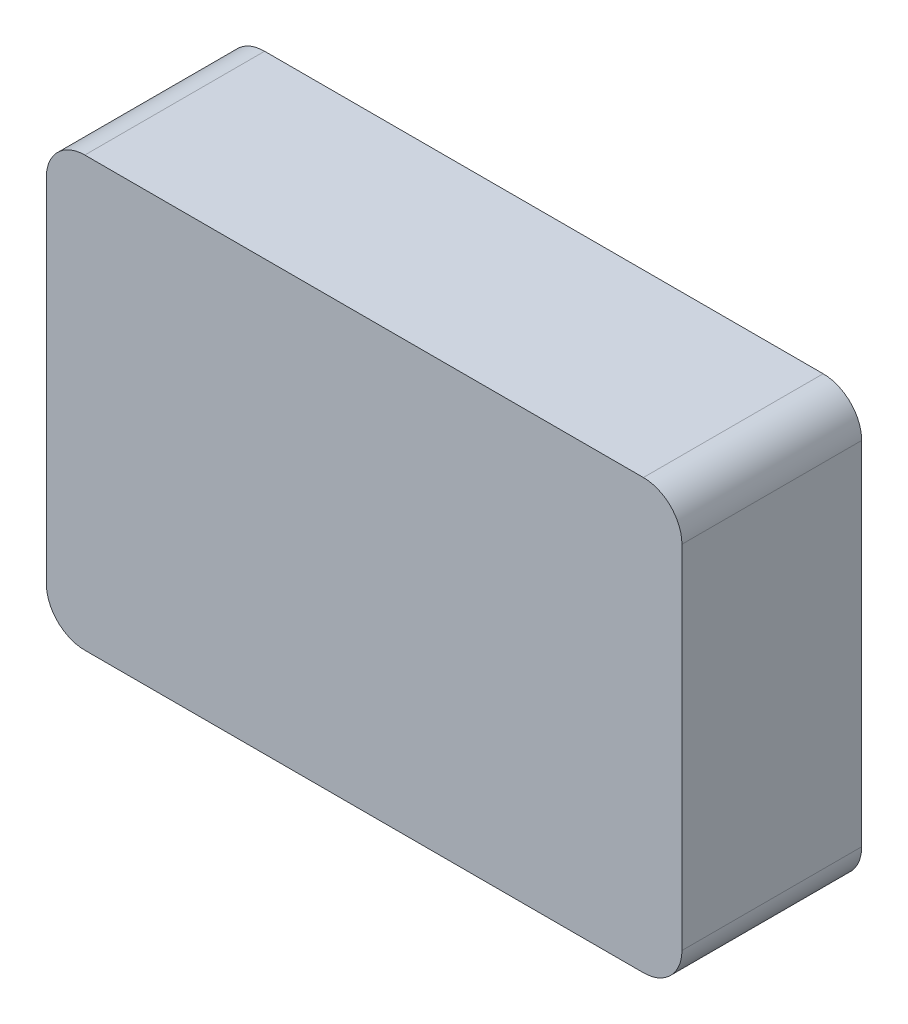
ISO-10303-21;
HEADER;
FILE_DESCRIPTION(('STEP AP214'),'2;1');
FILE_NAME('part.step','',(''),(''),'','','');
FILE_SCHEMA(('AUTOMOTIVE_DESIGN { 1 0 10303 214 1 1 1 1 }'));
ENDSEC;
DATA;
#1=APPLICATION_CONTEXT('core data for automotive mechanical design processes');
#2=APPLICATION_PROTOCOL_DEFINITION('international standard','automotive_design',2000,#1);
#3=PRODUCT_CONTEXT('',#1,'mechanical');
#4=PRODUCT('Part','Part','',(#3));
#5=PRODUCT_RELATED_PRODUCT_CATEGORY('part','',(#4));
#6=PRODUCT_DEFINITION_FORMATION('','',#4);
#7=PRODUCT_DEFINITION_CONTEXT('part definition',#1,'design');
#8=PRODUCT_DEFINITION('design','',#6,#7);
#9=PRODUCT_DEFINITION_SHAPE('','',#8);
#10=(LENGTH_UNIT() NAMED_UNIT(*) SI_UNIT(.MILLI.,.METRE.));
#11=(NAMED_UNIT(*) PLANE_ANGLE_UNIT() SI_UNIT($,.RADIAN.));
#12=(NAMED_UNIT(*) SI_UNIT($,.STERADIAN.) SOLID_ANGLE_UNIT());
#13=UNCERTAINTY_MEASURE_WITH_UNIT(LENGTH_MEASURE(1.E-05),#10,'distance_accuracy_value','');
#14=(GEOMETRIC_REPRESENTATION_CONTEXT(3) GLOBAL_UNCERTAINTY_ASSIGNED_CONTEXT((#13)) GLOBAL_UNIT_ASSIGNED_CONTEXT((#10,
#11,#12)) REPRESENTATION_CONTEXT('',''));
#15=CARTESIAN_POINT('',(0.,0.,0.));
#16=DIRECTION('',(0.,0.,1.));
#17=DIRECTION('',(1.,0.,0.));
#18=AXIS2_PLACEMENT_3D('',#15,#16,#17);
#19=CARTESIAN_POINT('',(0.,0.,8.));
#20=DIRECTION('',(0.,0.,1.));
#21=DIRECTION('',(1.,0.,0.));
#22=AXIS2_PLACEMENT_3D('',#19,#20,#21);
#23=PLANE('',#22);
#24=DIRECTION('',(-1.,0.,0.));
#25=VECTOR('',#24,1.);
#26=CARTESIAN_POINT('',(-22.75,14.7,8.));
#27=LINE('',#26,#25);
#28=CARTESIAN_POINT('',(22.75,14.7,8.));
#29=VERTEX_POINT('',#28);
#30=CARTESIAN_POINT('',(-22.75,14.7,8.));
#31=VERTEX_POINT('',#30);
#32=EDGE_CURVE('E35',#29,#31,#27,.T.);
#33=ORIENTED_EDGE('',*,*,#32,.T.);
#34=DIRECTION('',(0.,-1.,0.));
#35=VECTOR('',#34,1.);
#36=CARTESIAN_POINT('',(-22.75,13.7,8.));
#37=LINE('',#36,#35);
#38=CARTESIAN_POINT('',(-22.75,-14.7,8.));
#39=VERTEX_POINT('',#38);
#40=EDGE_CURVE('E146',#31,#39,#37,.T.);
#41=ORIENTED_EDGE('',*,*,#40,.T.);
#42=DIRECTION('',(1.,0.,0.));
#43=VECTOR('',#42,1.);
#44=CARTESIAN_POINT('',(-22.75,-14.7,8.));
#45=LINE('',#44,#43);
#46=CARTESIAN_POINT('',(22.75,-14.7,8.));
#47=VERTEX_POINT('',#46);
#48=EDGE_CURVE('E198',#39,#47,#45,.T.);
#49=ORIENTED_EDGE('',*,*,#48,.T.);
#50=DIRECTION('',(0.,1.,0.));
#51=VECTOR('',#50,1.);
#52=CARTESIAN_POINT('',(22.75,13.7,8.));
#53=LINE('',#52,#51);
#54=EDGE_CURVE('E187',#47,#29,#53,.T.);
#55=ORIENTED_EDGE('',*,*,#54,.T.);
#56=EDGE_LOOP('',(#33,#41,#49,#55));
#57=FACE_BOUND('',#56,.T.);
#58=CARTESIAN_POINT('',(-21.75,-13.7,8.));
#59=DIRECTION('',(0.,0.,1.));
#60=DIRECTION('',(1.,0.,0.));
#61=AXIS2_PLACEMENT_3D('',#58,#59,#60);
#62=CIRCLE('',#61,3.);
#63=CARTESIAN_POINT('',(-21.75,-16.7,8.));
#64=VERTEX_POINT('',#63);
#65=CARTESIAN_POINT('',(-24.75,-13.7,8.));
#66=VERTEX_POINT('',#65);
#67=EDGE_CURVE('E193',#64,#66,#62,.F.);
#68=ORIENTED_EDGE('',*,*,#67,.T.);
#69=DIRECTION('',(0.,-1.,0.));
#70=VECTOR('',#69,1.);
#71=CARTESIAN_POINT('',(-24.75,16.7,8.));
#72=LINE('',#71,#70);
#73=CARTESIAN_POINT('',(-24.75,13.7,8.));
#74=VERTEX_POINT('',#73);
#75=EDGE_CURVE('E185',#74,#66,#72,.T.);
#76=ORIENTED_EDGE('',*,*,#75,.F.);
#77=CARTESIAN_POINT('',(-21.75,13.7,8.));
#78=DIRECTION('',(0.,0.,1.));
#79=DIRECTION('',(1.,0.,0.));
#80=AXIS2_PLACEMENT_3D('',#77,#78,#79);
#81=CIRCLE('',#80,3.);
#82=CARTESIAN_POINT('',(-21.75,16.7,8.));
#83=VERTEX_POINT('',#82);
#84=EDGE_CURVE('E190',#74,#83,#81,.F.);
#85=ORIENTED_EDGE('',*,*,#84,.T.);
#86=DIRECTION('',(-1.,0.,0.));
#87=VECTOR('',#86,1.);
#88=CARTESIAN_POINT('',(-24.75,16.7,8.));
#89=LINE('',#88,#87);
#90=CARTESIAN_POINT('',(21.75,16.7,8.));
#91=VERTEX_POINT('',#90);
#92=EDGE_CURVE('E183',#91,#83,#89,.T.);
#93=ORIENTED_EDGE('',*,*,#92,.F.);
#94=CARTESIAN_POINT('',(21.75,13.7,8.));
#95=DIRECTION('',(0.,0.,1.));
#96=DIRECTION('',(1.,0.,0.));
#97=AXIS2_PLACEMENT_3D('',#94,#95,#96);
#98=CIRCLE('',#97,3.);
#99=CARTESIAN_POINT('',(24.75,13.7,8.));
#100=VERTEX_POINT('',#99);
#101=EDGE_CURVE('E11',#91,#100,#98,.F.);
#102=ORIENTED_EDGE('',*,*,#101,.T.);
#103=DIRECTION('',(0.,1.,0.));
#104=VECTOR('',#103,1.);
#105=CARTESIAN_POINT('',(24.75,16.7,8.));
#106=LINE('',#105,#104);
#107=CARTESIAN_POINT('',(24.75,-13.7,8.));
#108=VERTEX_POINT('',#107);
#109=EDGE_CURVE('E48',#108,#100,#106,.T.);
#110=ORIENTED_EDGE('',*,*,#109,.F.);
#111=CARTESIAN_POINT('',(21.75,-13.7,8.));
#112=DIRECTION('',(0.,0.,1.));
#113=DIRECTION('',(1.,0.,0.));
#114=AXIS2_PLACEMENT_3D('',#111,#112,#113);
#115=CIRCLE('',#114,3.);
#116=CARTESIAN_POINT('',(21.75,-16.7,8.));
#117=VERTEX_POINT('',#116);
#118=EDGE_CURVE('E40',#108,#117,#115,.F.);
#119=ORIENTED_EDGE('',*,*,#118,.T.);
#120=DIRECTION('',(1.,0.,0.));
#121=VECTOR('',#120,1.);
#122=CARTESIAN_POINT('',(-24.75,-16.7,8.));
#123=LINE('',#122,#121);
#124=EDGE_CURVE('E181',#64,#117,#123,.T.);
#125=ORIENTED_EDGE('',*,*,#124,.F.);
#126=EDGE_LOOP('',(#68,#76,#85,#93,#102,#110,#119,#125));
#127=FACE_BOUND('',#126,.T.);
#128=ADVANCED_FACE('F32',(#57,#127),#23,.F.);
#129=CARTESIAN_POINT('',(-18.5073593128807,-8.35,15.));
#130=DIRECTION('',(-1.,0.,0.));
#131=DIRECTION('',(0.,-1.,0.));
#132=AXIS2_PLACEMENT_3D('',#129,#130,#131);
#133=CYLINDRICAL_SURFACE('',#132,1.5);
#134=CARTESIAN_POINT('',(-22.75,-8.35,15.));
#135=DIRECTION('',(1.,0.,0.));
#136=DIRECTION('',(0.,1.,0.));
#137=AXIS2_PLACEMENT_3D('',#134,#135,#136);
#138=CIRCLE('',#137,1.5);
#139=CARTESIAN_POINT('',(-22.75,-9.85,15.));
#140=VERTEX_POINT('',#139);
#141=EDGE_CURVE('E497',#140,#140,#138,.F.);
#142=CARTESIAN_POINT('',(-24.35,-8.35,15.));
#143=DIRECTION('',(-1.,0.,0.));
#144=DIRECTION('',(0.,-1.,0.));
#145=AXIS2_PLACEMENT_3D('',#142,#143,#144);
#146=CIRCLE('',#145,1.5);
#147=CARTESIAN_POINT('',(-24.35,-9.85,15.));
#148=VERTEX_POINT('',#147);
#149=EDGE_CURVE('E487',#148,#148,#146,.T.);
#150=CARTESIAN_POINT('',(-22.75,-9.85,15.));
#151=CARTESIAN_POINT('',(-22.7666666666667,-9.85,15.));
#152=CARTESIAN_POINT('',(-22.7833333333333,-9.85,15.));
#153=CARTESIAN_POINT('',(-22.8166666666667,-9.85,15.));
#154=CARTESIAN_POINT('',(-22.8333333333333,-9.85,15.));
#155=CARTESIAN_POINT('',(-22.8666666666667,-9.85,15.));
#156=CARTESIAN_POINT('',(-22.8833333333333,-9.85,15.));
#157=CARTESIAN_POINT('',(-22.9166666666667,-9.85,15.));
#158=CARTESIAN_POINT('',(-22.9333333333333,-9.85,15.));
#159=CARTESIAN_POINT('',(-22.9666666666667,-9.85,15.));
#160=CARTESIAN_POINT('',(-22.9833333333333,-9.85,15.));
#161=CARTESIAN_POINT('',(-23.0166666666667,-9.85,15.));
#162=CARTESIAN_POINT('',(-23.0333333333333,-9.85,15.));
#163=CARTESIAN_POINT('',(-23.0666666666667,-9.85,15.));
#164=CARTESIAN_POINT('',(-23.0833333333333,-9.85,15.));
#165=CARTESIAN_POINT('',(-23.1166666666667,-9.85,15.));
#166=CARTESIAN_POINT('',(-23.1333333333333,-9.85,15.));
#167=CARTESIAN_POINT('',(-23.1666666666667,-9.85,15.));
#168=CARTESIAN_POINT('',(-23.1833333333333,-9.85,15.));
#169=CARTESIAN_POINT('',(-23.2166666666667,-9.85,15.));
#170=CARTESIAN_POINT('',(-23.2333333333333,-9.85,15.));
#171=CARTESIAN_POINT('',(-23.2666666666667,-9.85,15.));
#172=CARTESIAN_POINT('',(-23.2833333333333,-9.85,15.));
#173=CARTESIAN_POINT('',(-23.3166666666667,-9.85,15.));
#174=CARTESIAN_POINT('',(-23.3333333333333,-9.85,15.));
#175=CARTESIAN_POINT('',(-23.3666666666667,-9.85,15.));
#176=CARTESIAN_POINT('',(-23.3833333333333,-9.85,15.));
#177=CARTESIAN_POINT('',(-23.4166666666667,-9.85,15.));
#178=CARTESIAN_POINT('',(-23.4333333333333,-9.85,15.));
#179=CARTESIAN_POINT('',(-23.4666666666667,-9.85,15.));
#180=CARTESIAN_POINT('',(-23.4833333333333,-9.85,15.));
#181=CARTESIAN_POINT('',(-23.5166666666667,-9.85,15.));
#182=CARTESIAN_POINT('',(-23.5333333333333,-9.85,15.));
#183=CARTESIAN_POINT('',(-23.5666666666667,-9.85,15.));
#184=CARTESIAN_POINT('',(-23.5833333333333,-9.85,15.));
#185=CARTESIAN_POINT('',(-23.6166666666667,-9.85,15.));
#186=CARTESIAN_POINT('',(-23.6333333333333,-9.85,15.));
#187=CARTESIAN_POINT('',(-23.6666666666667,-9.85,15.));
#188=CARTESIAN_POINT('',(-23.6833333333333,-9.85,15.));
#189=CARTESIAN_POINT('',(-23.7166666666667,-9.85,15.));
#190=CARTESIAN_POINT('',(-23.7333333333333,-9.85,15.));
#191=CARTESIAN_POINT('',(-23.7666666666667,-9.85,15.));
#192=CARTESIAN_POINT('',(-23.7833333333333,-9.85,15.));
#193=CARTESIAN_POINT('',(-23.8166666666667,-9.85,15.));
#194=CARTESIAN_POINT('',(-23.8333333333333,-9.85,15.));
#195=CARTESIAN_POINT('',(-23.8666666666667,-9.85,15.));
#196=CARTESIAN_POINT('',(-23.8833333333333,-9.85,15.));
#197=CARTESIAN_POINT('',(-23.9166666666667,-9.85,15.));
#198=CARTESIAN_POINT('',(-23.9333333333333,-9.85,15.));
#199=CARTESIAN_POINT('',(-23.9666666666667,-9.85,15.));
#200=CARTESIAN_POINT('',(-23.9833333333333,-9.85,15.));
#201=CARTESIAN_POINT('',(-24.0166666666667,-9.85,15.));
#202=CARTESIAN_POINT('',(-24.0333333333333,-9.85,15.));
#203=CARTESIAN_POINT('',(-24.0666666666667,-9.85,15.));
#204=CARTESIAN_POINT('',(-24.0833333333333,-9.85,15.));
#205=CARTESIAN_POINT('',(-24.1166666666667,-9.85,15.));
#206=CARTESIAN_POINT('',(-24.1333333333333,-9.85,15.));
#207=CARTESIAN_POINT('',(-24.1666666666667,-9.85,15.));
#208=CARTESIAN_POINT('',(-24.1833333333333,-9.85,15.));
#209=CARTESIAN_POINT('',(-24.2166666666667,-9.85,15.));
#210=CARTESIAN_POINT('',(-24.2333333333333,-9.85,15.));
#211=CARTESIAN_POINT('',(-24.2666666666667,-9.85,15.));
#212=CARTESIAN_POINT('',(-24.2833333333333,-9.85,15.));
#213=CARTESIAN_POINT('',(-24.3166666666667,-9.85,15.));
#214=CARTESIAN_POINT('',(-24.3333333333333,-9.85,15.));
#215=CARTESIAN_POINT('',(-24.35,-9.85,15.));
#216=B_SPLINE_CURVE_WITH_KNOTS('',3,(#150,#151,#152,#153,#154,#155,#156,#157,#158,#159,#160,
#161,#162,#163,#164,#165,#166,#167,#168,#169,#170,#171,#172,#173,#174,#175,#176,#177,#178,#179,
#180,#181,#182,#183,#184,#185,#186,#187,#188,#189,#190,#191,#192,#193,#194,#195,#196,#197,#198,
#199,#200,#201,#202,#203,#204,#205,#206,#207,#208,#209,#210,#211,#212,#213,#214,#215),
.UNSPECIFIED.,.F.,.F.,(4,2,2,2,2,2,2,2,2,2,2,2,2,2,2,2,2,2,2,2,2,2,2,2,2,2,2,2,2,2,2,2,4),(0.,
0.0500000000000014,0.0999999999999994,0.150000000000001,0.200000000000002,0.250000000000004,
0.300000000000002,0.350000000000003,0.400000000000005,0.450000000000003,0.500000000000004,
0.550000000000005,0.600000000000003,0.650000000000005,0.700000000000006,0.750000000000004,
0.800000000000006,0.850000000000007,0.900000000000005,0.950000000000006,1.00000000000001,
1.05000000000001,1.10000000000001,1.15000000000001,1.20000000000001,1.25000000000001,
1.30000000000001,1.35000000000001,1.40000000000001,1.45000000000001,1.50000000000001,
1.55000000000001,1.60000000000001),.UNSPECIFIED.);
#217=EDGE_CURVE('BSEAM227',#140,#148,#216,.T.);
#218=ORIENTED_EDGE('',*,*,#141,.F.);
#219=ORIENTED_EDGE('',*,*,#149,.T.);
#220=ORIENTED_EDGE('',*,*,#217,.T.);
#221=ORIENTED_EDGE('',*,*,#217,.F.);
#222=EDGE_LOOP('',(#218,#220,#219,#221));
#223=FACE_BOUND('',#222,.T.);
#224=ADVANCED_FACE('F227',(#223),#133,.F.);
#225=CARTESIAN_POINT('',(-18.5073593128807,0.,15.));
#226=DIRECTION('',(-1.,0.,0.));
#227=DIRECTION('',(0.,-1.,0.));
#228=AXIS2_PLACEMENT_3D('',#225,#226,#227);
#229=CYLINDRICAL_SURFACE('',#228,1.5);
#230=CARTESIAN_POINT('',(-22.75,0.,15.));
#231=DIRECTION('',(1.,0.,0.));
#232=DIRECTION('',(0.,1.,0.));
#233=AXIS2_PLACEMENT_3D('',#230,#231,#232);
#234=CIRCLE('',#233,1.5);
#235=CARTESIAN_POINT('',(-22.75,-1.5,15.));
#236=VERTEX_POINT('',#235);
#237=EDGE_CURVE('E467',#236,#236,#234,.F.);
#238=CARTESIAN_POINT('',(-24.35,0.,15.));
#239=DIRECTION('',(-1.,0.,0.));
#240=DIRECTION('',(0.,-1.,0.));
#241=AXIS2_PLACEMENT_3D('',#238,#239,#240);
#242=CIRCLE('',#241,1.5);
#243=CARTESIAN_POINT('',(-24.35,-1.5,15.));
#244=VERTEX_POINT('',#243);
#245=EDGE_CURVE('E470',#244,#244,#242,.T.);
#246=CARTESIAN_POINT('',(-22.75,-1.5,15.));
#247=CARTESIAN_POINT('',(-22.7666666666667,-1.5,15.));
#248=CARTESIAN_POINT('',(-22.7833333333333,-1.5,15.));
#249=CARTESIAN_POINT('',(-22.8166666666667,-1.5,15.));
#250=CARTESIAN_POINT('',(-22.8333333333333,-1.5,15.));
#251=CARTESIAN_POINT('',(-22.8666666666667,-1.5,15.));
#252=CARTESIAN_POINT('',(-22.8833333333333,-1.5,15.));
#253=CARTESIAN_POINT('',(-22.9166666666667,-1.5,15.));
#254=CARTESIAN_POINT('',(-22.9333333333333,-1.5,15.));
#255=CARTESIAN_POINT('',(-22.9666666666667,-1.5,15.));
#256=CARTESIAN_POINT('',(-22.9833333333333,-1.5,15.));
#257=CARTESIAN_POINT('',(-23.0166666666667,-1.5,15.));
#258=CARTESIAN_POINT('',(-23.0333333333333,-1.5,15.));
#259=CARTESIAN_POINT('',(-23.0666666666667,-1.5,15.));
#260=CARTESIAN_POINT('',(-23.0833333333333,-1.5,15.));
#261=CARTESIAN_POINT('',(-23.1166666666667,-1.5,15.));
#262=CARTESIAN_POINT('',(-23.1333333333333,-1.5,15.));
#263=CARTESIAN_POINT('',(-23.1666666666667,-1.5,15.));
#264=CARTESIAN_POINT('',(-23.1833333333333,-1.5,15.));
#265=CARTESIAN_POINT('',(-23.2166666666667,-1.5,15.));
#266=CARTESIAN_POINT('',(-23.2333333333333,-1.5,15.));
#267=CARTESIAN_POINT('',(-23.2666666666667,-1.5,15.));
#268=CARTESIAN_POINT('',(-23.2833333333333,-1.5,15.));
#269=CARTESIAN_POINT('',(-23.3166666666667,-1.5,15.));
#270=CARTESIAN_POINT('',(-23.3333333333333,-1.5,15.));
#271=CARTESIAN_POINT('',(-23.3666666666667,-1.5,15.));
#272=CARTESIAN_POINT('',(-23.3833333333333,-1.5,15.));
#273=CARTESIAN_POINT('',(-23.4166666666667,-1.5,15.));
#274=CARTESIAN_POINT('',(-23.4333333333333,-1.5,15.));
#275=CARTESIAN_POINT('',(-23.4666666666667,-1.5,15.));
#276=CARTESIAN_POINT('',(-23.4833333333333,-1.5,15.));
#277=CARTESIAN_POINT('',(-23.5166666666667,-1.5,15.));
#278=CARTESIAN_POINT('',(-23.5333333333333,-1.5,15.));
#279=CARTESIAN_POINT('',(-23.5666666666667,-1.5,15.));
#280=CARTESIAN_POINT('',(-23.5833333333333,-1.5,15.));
#281=CARTESIAN_POINT('',(-23.6166666666667,-1.5,15.));
#282=CARTESIAN_POINT('',(-23.6333333333333,-1.5,15.));
#283=CARTESIAN_POINT('',(-23.6666666666667,-1.5,15.));
#284=CARTESIAN_POINT('',(-23.6833333333333,-1.5,15.));
#285=CARTESIAN_POINT('',(-23.7166666666667,-1.5,15.));
#286=CARTESIAN_POINT('',(-23.7333333333333,-1.5,15.));
#287=CARTESIAN_POINT('',(-23.7666666666667,-1.5,15.));
#288=CARTESIAN_POINT('',(-23.7833333333333,-1.5,15.));
#289=CARTESIAN_POINT('',(-23.8166666666667,-1.5,15.));
#290=CARTESIAN_POINT('',(-23.8333333333333,-1.5,15.));
#291=CARTESIAN_POINT('',(-23.8666666666667,-1.5,15.));
#292=CARTESIAN_POINT('',(-23.8833333333333,-1.5,15.));
#293=CARTESIAN_POINT('',(-23.9166666666667,-1.5,15.));
#294=CARTESIAN_POINT('',(-23.9333333333333,-1.5,15.));
#295=CARTESIAN_POINT('',(-23.9666666666667,-1.5,15.));
#296=CARTESIAN_POINT('',(-23.9833333333333,-1.5,15.));
#297=CARTESIAN_POINT('',(-24.0166666666667,-1.5,15.));
#298=CARTESIAN_POINT('',(-24.0333333333333,-1.5,15.));
#299=CARTESIAN_POINT('',(-24.0666666666667,-1.5,15.));
#300=CARTESIAN_POINT('',(-24.0833333333333,-1.5,15.));
#301=CARTESIAN_POINT('',(-24.1166666666667,-1.5,15.));
#302=CARTESIAN_POINT('',(-24.1333333333333,-1.5,15.));
#303=CARTESIAN_POINT('',(-24.1666666666667,-1.5,15.));
#304=CARTESIAN_POINT('',(-24.1833333333333,-1.5,15.));
#305=CARTESIAN_POINT('',(-24.2166666666667,-1.5,15.));
#306=CARTESIAN_POINT('',(-24.2333333333333,-1.5,15.));
#307=CARTESIAN_POINT('',(-24.2666666666667,-1.5,15.));
#308=CARTESIAN_POINT('',(-24.2833333333333,-1.5,15.));
#309=CARTESIAN_POINT('',(-24.3166666666667,-1.5,15.));
#310=CARTESIAN_POINT('',(-24.3333333333333,-1.5,15.));
#311=CARTESIAN_POINT('',(-24.35,-1.5,15.));
#312=B_SPLINE_CURVE_WITH_KNOTS('',3,(#246,#247,#248,#249,#250,#251,#252,#253,#254,#255,#256,
#257,#258,#259,#260,#261,#262,#263,#264,#265,#266,#267,#268,#269,#270,#271,#272,#273,#274,#275,
#276,#277,#278,#279,#280,#281,#282,#283,#284,#285,#286,#287,#288,#289,#290,#291,#292,#293,#294,
#295,#296,#297,#298,#299,#300,#301,#302,#303,#304,#305,#306,#307,#308,#309,#310,#311),
.UNSPECIFIED.,.F.,.F.,(4,2,2,2,2,2,2,2,2,2,2,2,2,2,2,2,2,2,2,2,2,2,2,2,2,2,2,2,2,2,2,2,4),(0.,
0.049999999999998,0.0999999999999994,0.150000000000001,0.199999999999999,0.25,0.299999999999998,
0.35,0.400000000000001,0.449999999999999,0.5,0.550000000000002,0.6,0.650000000000001,
0.700000000000003,0.750000000000001,0.800000000000002,0.85,0.900000000000001,0.950000000000003,
1.,1.05,1.1,1.15,1.2,1.25,1.3,1.35,1.4,1.45,1.5,1.55,1.6),.UNSPECIFIED.);
#313=EDGE_CURVE('BSEAM233',#236,#244,#312,.T.);
#314=ORIENTED_EDGE('',*,*,#237,.F.);
#315=ORIENTED_EDGE('',*,*,#245,.T.);
#316=ORIENTED_EDGE('',*,*,#313,.T.);
#317=ORIENTED_EDGE('',*,*,#313,.F.);
#318=EDGE_LOOP('',(#314,#316,#315,#317));
#319=FACE_BOUND('',#318,.T.);
#320=ADVANCED_FACE('F233',(#319),#229,.F.);
#321=CARTESIAN_POINT('',(-18.5073593128807,8.35,15.));
#322=DIRECTION('',(-1.,0.,0.));
#323=DIRECTION('',(0.,-1.,0.));
#324=AXIS2_PLACEMENT_3D('',#321,#322,#323);
#325=CYLINDRICAL_SURFACE('',#324,1.5);
#326=CARTESIAN_POINT('',(-22.75,8.35,15.));
#327=DIRECTION('',(1.,0.,0.));
#328=DIRECTION('',(0.,1.,0.));
#329=AXIS2_PLACEMENT_3D('',#326,#327,#328);
#330=CIRCLE('',#329,1.5);
#331=CARTESIAN_POINT('',(-22.75,6.85,15.));
#332=VERTEX_POINT('',#331);
#333=EDGE_CURVE('E492',#332,#332,#330,.F.);
#334=CARTESIAN_POINT('',(-24.35,8.35,15.));
#335=DIRECTION('',(-1.,0.,0.));
#336=DIRECTION('',(0.,-1.,0.));
#337=AXIS2_PLACEMENT_3D('',#334,#335,#336);
#338=CIRCLE('',#337,1.5);
#339=CARTESIAN_POINT('',(-24.35,6.85,15.));
#340=VERTEX_POINT('',#339);
#341=EDGE_CURVE('E485',#340,#340,#338,.T.);
#342=CARTESIAN_POINT('',(-22.75,6.85,15.));
#343=CARTESIAN_POINT('',(-22.7666666666667,6.85,15.));
#344=CARTESIAN_POINT('',(-22.7833333333333,6.85,15.));
#345=CARTESIAN_POINT('',(-22.8166666666667,6.85,15.));
#346=CARTESIAN_POINT('',(-22.8333333333333,6.85,15.));
#347=CARTESIAN_POINT('',(-22.8666666666667,6.85,15.));
#348=CARTESIAN_POINT('',(-22.8833333333333,6.85,15.));
#349=CARTESIAN_POINT('',(-22.9166666666667,6.85,15.));
#350=CARTESIAN_POINT('',(-22.9333333333333,6.85,15.));
#351=CARTESIAN_POINT('',(-22.9666666666667,6.85,15.));
#352=CARTESIAN_POINT('',(-22.9833333333333,6.85,15.));
#353=CARTESIAN_POINT('',(-23.0166666666667,6.85,15.));
#354=CARTESIAN_POINT('',(-23.0333333333333,6.85,15.));
#355=CARTESIAN_POINT('',(-23.0666666666667,6.85,15.));
#356=CARTESIAN_POINT('',(-23.0833333333333,6.85,15.));
#357=CARTESIAN_POINT('',(-23.1166666666667,6.85,15.));
#358=CARTESIAN_POINT('',(-23.1333333333333,6.85,15.));
#359=CARTESIAN_POINT('',(-23.1666666666667,6.85,15.));
#360=CARTESIAN_POINT('',(-23.1833333333333,6.85,15.));
#361=CARTESIAN_POINT('',(-23.2166666666667,6.85,15.));
#362=CARTESIAN_POINT('',(-23.2333333333333,6.85,15.));
#363=CARTESIAN_POINT('',(-23.2666666666667,6.85,15.));
#364=CARTESIAN_POINT('',(-23.2833333333333,6.85,15.));
#365=CARTESIAN_POINT('',(-23.3166666666667,6.85,15.));
#366=CARTESIAN_POINT('',(-23.3333333333333,6.85,15.));
#367=CARTESIAN_POINT('',(-23.3666666666667,6.85,15.));
#368=CARTESIAN_POINT('',(-23.3833333333333,6.85,15.));
#369=CARTESIAN_POINT('',(-23.4166666666667,6.85,15.));
#370=CARTESIAN_POINT('',(-23.4333333333333,6.85,15.));
#371=CARTESIAN_POINT('',(-23.4666666666667,6.85,15.));
#372=CARTESIAN_POINT('',(-23.4833333333333,6.85,15.));
#373=CARTESIAN_POINT('',(-23.5166666666667,6.85,15.));
#374=CARTESIAN_POINT('',(-23.5333333333333,6.85,15.));
#375=CARTESIAN_POINT('',(-23.5666666666667,6.85,15.));
#376=CARTESIAN_POINT('',(-23.5833333333333,6.85,15.));
#377=CARTESIAN_POINT('',(-23.6166666666667,6.85,15.));
#378=CARTESIAN_POINT('',(-23.6333333333333,6.85,15.));
#379=CARTESIAN_POINT('',(-23.6666666666667,6.85,15.));
#380=CARTESIAN_POINT('',(-23.6833333333333,6.85,15.));
#381=CARTESIAN_POINT('',(-23.7166666666667,6.85,15.));
#382=CARTESIAN_POINT('',(-23.7333333333333,6.85,15.));
#383=CARTESIAN_POINT('',(-23.7666666666667,6.85,15.));
#384=CARTESIAN_POINT('',(-23.7833333333333,6.85,15.));
#385=CARTESIAN_POINT('',(-23.8166666666667,6.85,15.));
#386=CARTESIAN_POINT('',(-23.8333333333333,6.85,15.));
#387=CARTESIAN_POINT('',(-23.8666666666667,6.85,15.));
#388=CARTESIAN_POINT('',(-23.8833333333333,6.85,15.));
#389=CARTESIAN_POINT('',(-23.9166666666667,6.85,15.));
#390=CARTESIAN_POINT('',(-23.9333333333333,6.85,15.));
#391=CARTESIAN_POINT('',(-23.9666666666667,6.85,15.));
#392=CARTESIAN_POINT('',(-23.9833333333333,6.85,15.));
#393=CARTESIAN_POINT('',(-24.0166666666667,6.85,15.));
#394=CARTESIAN_POINT('',(-24.0333333333333,6.85,15.));
#395=CARTESIAN_POINT('',(-24.0666666666667,6.85,15.));
#396=CARTESIAN_POINT('',(-24.0833333333333,6.85,15.));
#397=CARTESIAN_POINT('',(-24.1166666666667,6.85,15.));
#398=CARTESIAN_POINT('',(-24.1333333333333,6.85,15.));
#399=CARTESIAN_POINT('',(-24.1666666666667,6.85,15.));
#400=CARTESIAN_POINT('',(-24.1833333333333,6.85,15.));
#401=CARTESIAN_POINT('',(-24.2166666666667,6.85,15.));
#402=CARTESIAN_POINT('',(-24.2333333333333,6.85,15.));
#403=CARTESIAN_POINT('',(-24.2666666666667,6.85,15.));
#404=CARTESIAN_POINT('',(-24.2833333333333,6.85,15.));
#405=CARTESIAN_POINT('',(-24.3166666666667,6.85,15.));
#406=CARTESIAN_POINT('',(-24.3333333333333,6.85,15.));
#407=CARTESIAN_POINT('',(-24.35,6.85,15.));
#408=B_SPLINE_CURVE_WITH_KNOTS('',3,(#342,#343,#344,#345,#346,#347,#348,#349,#350,#351,#352,
#353,#354,#355,#356,#357,#358,#359,#360,#361,#362,#363,#364,#365,#366,#367,#368,#369,#370,#371,
#372,#373,#374,#375,#376,#377,#378,#379,#380,#381,#382,#383,#384,#385,#386,#387,#388,#389,#390,
#391,#392,#393,#394,#395,#396,#397,#398,#399,#400,#401,#402,#403,#404,#405,#406,#407),
.UNSPECIFIED.,.F.,.F.,(4,2,2,2,2,2,2,2,2,2,2,2,2,2,2,2,2,2,2,2,2,2,2,2,2,2,2,2,2,2,2,2,4),(0.,
0.0500000000000014,0.0999999999999994,0.150000000000001,0.200000000000002,0.25,
0.300000000000002,0.35,0.400000000000001,0.450000000000003,0.5,0.550000000000002,0.6,
0.650000000000001,0.700000000000003,0.750000000000001,0.800000000000002,0.850000000000004,
0.900000000000001,0.950000000000003,1.,1.05,1.1,1.15,1.2,1.25,1.3,1.35,1.4,1.45,1.5,1.55,1.6),.UNSPECIFIED.);
#409=EDGE_CURVE('BSEAM256',#332,#340,#408,.T.);
#410=ORIENTED_EDGE('',*,*,#333,.F.);
#411=ORIENTED_EDGE('',*,*,#341,.T.);
#412=ORIENTED_EDGE('',*,*,#409,.T.);
#413=ORIENTED_EDGE('',*,*,#409,.F.);
#414=EDGE_LOOP('',(#410,#412,#411,#413));
#415=FACE_BOUND('',#414,.T.);
#416=ADVANCED_FACE('F256',(#415),#325,.F.);
#417=CARTESIAN_POINT('',(24.75,16.7,2.));
#418=DIRECTION('',(-1.,0.,0.));
#419=DIRECTION('',(0.,-1.,0.));
#420=AXIS2_PLACEMENT_3D('',#417,#418,#419);
#421=PLANE('',#420);
#422=DIRECTION('',(0.,0.,-1.));
#423=VECTOR('',#422,1.);
#424=CARTESIAN_POINT('',(24.75,-13.7,2.));
#425=LINE('',#424,#423);
#426=CARTESIAN_POINT('',(24.75,-13.7,22.));
#427=VERTEX_POINT('',#426);
#428=EDGE_CURVE('E180',#427,#108,#425,.T.);
#429=ORIENTED_EDGE('',*,*,#428,.T.);
#430=ORIENTED_EDGE('',*,*,#109,.T.);
#431=DIRECTION('',(0.,0.,-1.));
#432=VECTOR('',#431,1.);
#433=CARTESIAN_POINT('',(24.75,13.7,2.));
#434=LINE('',#433,#432);
#435=CARTESIAN_POINT('',(24.75,13.7,22.));
#436=VERTEX_POINT('',#435);
#437=EDGE_CURVE('E178',#100,#436,#434,.F.);
#438=ORIENTED_EDGE('',*,*,#437,.T.);
#439=DIRECTION('',(0.,1.,0.));
#440=VECTOR('',#439,1.);
#441=CARTESIAN_POINT('',(24.75,-16.7,22.));
#442=LINE('',#441,#440);
#443=EDGE_CURVE('E210',#427,#436,#442,.T.);
#444=ORIENTED_EDGE('',*,*,#443,.F.);
#445=EDGE_LOOP('',(#429,#430,#438,#444));
#446=FACE_BOUND('',#445,.T.);
#447=ADVANCED_FACE('F252',(#446),#421,.F.);
#448=CARTESIAN_POINT('',(-24.75,16.7,2.));
#449=DIRECTION('',(0.,-1.,0.));
#450=DIRECTION('',(0.,0.,-1.));
#451=AXIS2_PLACEMENT_3D('',#448,#449,#450);
#452=PLANE('',#451);
#453=DIRECTION('',(0.,0.,-1.));
#454=VECTOR('',#453,1.);
#455=CARTESIAN_POINT('',(21.75,16.7,2.));
#456=LINE('',#455,#454);
#457=CARTESIAN_POINT('',(21.75,16.7,22.));
#458=VERTEX_POINT('',#457);
#459=EDGE_CURVE('E173',#458,#91,#456,.T.);
#460=ORIENTED_EDGE('',*,*,#459,.T.);
#461=ORIENTED_EDGE('',*,*,#92,.T.);
#462=DIRECTION('',(0.,0.,-1.));
#463=VECTOR('',#462,1.);
#464=CARTESIAN_POINT('',(-21.75,16.7,2.));
#465=LINE('',#464,#463);
#466=CARTESIAN_POINT('',(-21.75,16.7,22.));
#467=VERTEX_POINT('',#466);
#468=EDGE_CURVE('E176',#83,#467,#465,.F.);
#469=ORIENTED_EDGE('',*,*,#468,.T.);
#470=DIRECTION('',(-1.,0.,0.));
#471=VECTOR('',#470,1.);
#472=CARTESIAN_POINT('',(24.75,16.7,22.));
#473=LINE('',#472,#471);
#474=EDGE_CURVE('E207',#458,#467,#473,.T.);
#475=ORIENTED_EDGE('',*,*,#474,.F.);
#476=EDGE_LOOP('',(#460,#461,#469,#475));
#477=FACE_BOUND('',#476,.T.);
#478=ADVANCED_FACE('F255',(#477),#452,.F.);
#479=CARTESIAN_POINT('',(-24.75,16.7,2.));
#480=DIRECTION('',(1.,0.,0.));
#481=DIRECTION('',(0.,1.,0.));
#482=AXIS2_PLACEMENT_3D('',#479,#480,#481);
#483=PLANE('',#482);
#484=CARTESIAN_POINT('',(-24.75,8.35,15.));
#485=DIRECTION('',(-1.,0.,0.));
#486=DIRECTION('',(0.,-1.,0.));
#487=AXIS2_PLACEMENT_3D('',#484,#485,#486);
#488=CIRCLE('',#487,3.65);
#489=CARTESIAN_POINT('',(-24.75,4.7,15.));
#490=VERTEX_POINT('',#489);
#491=EDGE_CURVE('E482',#490,#490,#488,.T.);
#492=ORIENTED_EDGE('',*,*,#491,.F.);
#493=EDGE_LOOP('',(#492));
#494=FACE_BOUND('',#493,.T.);
#495=CARTESIAN_POINT('',(-24.75,0.,15.));
#496=DIRECTION('',(-1.,0.,0.));
#497=DIRECTION('',(0.,-1.,0.));
#498=AXIS2_PLACEMENT_3D('',#495,#496,#497);
#499=CIRCLE('',#498,3.65);
#500=CARTESIAN_POINT('',(-24.75,-3.65,15.));
#501=VERTEX_POINT('',#500);
#502=EDGE_CURVE('E471',#501,#501,#499,.T.);
#503=ORIENTED_EDGE('',*,*,#502,.F.);
#504=EDGE_LOOP('',(#503));
#505=FACE_BOUND('',#504,.T.);
#506=CARTESIAN_POINT('',(-24.75,-8.35,15.));
#507=DIRECTION('',(-1.,0.,0.));
#508=DIRECTION('',(0.,-1.,0.));
#509=AXIS2_PLACEMENT_3D('',#506,#507,#508);
#510=CIRCLE('',#509,3.65);
#511=CARTESIAN_POINT('',(-24.75,-12.,15.));
#512=VERTEX_POINT('',#511);
#513=EDGE_CURVE('E478',#512,#512,#510,.T.);
#514=ORIENTED_EDGE('',*,*,#513,.F.);
#515=EDGE_LOOP('',(#514));
#516=FACE_BOUND('',#515,.T.);
#517=DIRECTION('',(0.,0.,-1.));
#518=VECTOR('',#517,1.);
#519=CARTESIAN_POINT('',(-24.75,13.7,2.));
#520=LINE('',#519,#518);
#521=CARTESIAN_POINT('',(-24.75,13.7,22.));
#522=VERTEX_POINT('',#521);
#523=EDGE_CURVE('E160',#522,#74,#520,.T.);
#524=ORIENTED_EDGE('',*,*,#523,.T.);
#525=ORIENTED_EDGE('',*,*,#75,.T.);
#526=DIRECTION('',(0.,0.,-1.));
#527=VECTOR('',#526,1.);
#528=CARTESIAN_POINT('',(-24.75,-13.7,2.));
#529=LINE('',#528,#527);
#530=CARTESIAN_POINT('',(-24.75,-13.7,22.));
#531=VERTEX_POINT('',#530);
#532=EDGE_CURVE('E163',#66,#531,#529,.F.);
#533=ORIENTED_EDGE('',*,*,#532,.T.);
#534=DIRECTION('',(0.,-1.,0.));
#535=VECTOR('',#534,1.);
#536=CARTESIAN_POINT('',(-24.75,16.7,22.));
#537=LINE('',#536,#535);
#538=EDGE_CURVE('E495',#522,#531,#537,.T.);
#539=ORIENTED_EDGE('',*,*,#538,.F.);
#540=EDGE_LOOP('',(#524,#525,#533,#539));
#541=FACE_BOUND('',#540,.T.);
#542=ADVANCED_FACE('F259',(#494,#505,#516,#541),#483,.F.);
#543=CARTESIAN_POINT('',(-24.75,-16.7,2.));
#544=DIRECTION('',(0.,1.,0.));
#545=DIRECTION('',(0.,0.,1.));
#546=AXIS2_PLACEMENT_3D('',#543,#544,#545);
#547=PLANE('',#546);
#548=DIRECTION('',(0.,0.,-1.));
#549=VECTOR('',#548,1.);
#550=CARTESIAN_POINT('',(-21.75,-16.7,2.));
#551=LINE('',#550,#549);
#552=CARTESIAN_POINT('',(-21.75,-16.7,22.));
#553=VERTEX_POINT('',#552);
#554=EDGE_CURVE('E157',#553,#64,#551,.T.);
#555=ORIENTED_EDGE('',*,*,#554,.T.);
#556=ORIENTED_EDGE('',*,*,#124,.T.);
#557=DIRECTION('',(0.,0.,-1.));
#558=VECTOR('',#557,1.);
#559=CARTESIAN_POINT('',(21.75,-16.7,2.));
#560=LINE('',#559,#558);
#561=CARTESIAN_POINT('',(21.75,-16.7,22.));
#562=VERTEX_POINT('',#561);
#563=EDGE_CURVE('E150',#117,#562,#560,.F.);
#564=ORIENTED_EDGE('',*,*,#563,.T.);
#565=DIRECTION('',(1.,0.,0.));
#566=VECTOR('',#565,1.);
#567=CARTESIAN_POINT('',(-24.75,-16.7,22.));
#568=LINE('',#567,#566);
#569=EDGE_CURVE('E503',#553,#562,#568,.T.);
#570=ORIENTED_EDGE('',*,*,#569,.F.);
#571=EDGE_LOOP('',(#555,#556,#564,#570));
#572=FACE_BOUND('',#571,.T.);
#573=ADVANCED_FACE('F263',(#572),#547,.F.);
#574=CARTESIAN_POINT('',(22.75,13.7,2.));
#575=DIRECTION('',(-1.,0.,0.));
#576=DIRECTION('',(0.,-1.,0.));
#577=AXIS2_PLACEMENT_3D('',#574,#575,#576);
#578=PLANE('',#577);
#579=ORIENTED_EDGE('',*,*,#54,.F.);
#580=DIRECTION('',(0.,0.,-1.));
#581=VECTOR('',#580,1.);
#582=CARTESIAN_POINT('',(22.75,-14.7,21.));
#583=LINE('',#582,#581);
#584=CARTESIAN_POINT('',(22.75,-14.7,21.));
#585=VERTEX_POINT('',#584);
#586=EDGE_CURVE('E152',#585,#47,#583,.T.);
#587=ORIENTED_EDGE('',*,*,#586,.F.);
#588=DIRECTION('',(0.,1.,0.));
#589=VECTOR('',#588,1.);
#590=CARTESIAN_POINT('',(22.75,14.7,21.));
#591=LINE('',#590,#589);
#592=CARTESIAN_POINT('',(22.75,14.7,21.));
#593=VERTEX_POINT('',#592);
#594=EDGE_CURVE('E141',#585,#593,#591,.T.);
#595=ORIENTED_EDGE('',*,*,#594,.T.);
#596=DIRECTION('',(0.,0.,-1.));
#597=VECTOR('',#596,1.);
#598=CARTESIAN_POINT('',(22.75,14.7,21.));
#599=LINE('',#598,#597);
#600=EDGE_CURVE('E140',#593,#29,#599,.T.);
#601=ORIENTED_EDGE('',*,*,#600,.T.);
#602=EDGE_LOOP('',(#579,#587,#595,#601));
#603=FACE_BOUND('',#602,.T.);
#604=ADVANCED_FACE('F206',(#603),#578,.T.);
#605=CARTESIAN_POINT('',(-22.75,13.7,2.));
#606=DIRECTION('',(1.,0.,0.));
#607=DIRECTION('',(0.,1.,0.));
#608=AXIS2_PLACEMENT_3D('',#605,#606,#607);
#609=PLANE('',#608);
#610=ORIENTED_EDGE('',*,*,#40,.F.);
#611=DIRECTION('',(0.,0.,-1.));
#612=VECTOR('',#611,1.);
#613=CARTESIAN_POINT('',(-22.75,14.7,21.));
#614=LINE('',#613,#612);
#615=CARTESIAN_POINT('',(-22.75,14.7,21.));
#616=VERTEX_POINT('',#615);
#617=EDGE_CURVE('E138',#616,#31,#614,.T.);
#618=ORIENTED_EDGE('',*,*,#617,.F.);
#619=DIRECTION('',(0.,-1.,0.));
#620=VECTOR('',#619,1.);
#621=CARTESIAN_POINT('',(-22.75,14.7,21.));
#622=LINE('',#621,#620);
#623=CARTESIAN_POINT('',(-22.75,-14.7,21.));
#624=VERTEX_POINT('',#623);
#625=EDGE_CURVE('E121',#616,#624,#622,.T.);
#626=ORIENTED_EDGE('',*,*,#625,.T.);
#627=DIRECTION('',(0.,0.,-1.));
#628=VECTOR('',#627,1.);
#629=CARTESIAN_POINT('',(-22.75,-14.7,21.));
#630=LINE('',#629,#628);
#631=EDGE_CURVE('E148',#624,#39,#630,.T.);
#632=ORIENTED_EDGE('',*,*,#631,.T.);
#633=EDGE_LOOP('',(#610,#618,#626,#632));
#634=FACE_BOUND('',#633,.T.);
#635=ORIENTED_EDGE('',*,*,#333,.T.);
#636=EDGE_LOOP('',(#635));
#637=FACE_BOUND('',#636,.T.);
#638=ORIENTED_EDGE('',*,*,#237,.T.);
#639=EDGE_LOOP('',(#638));
#640=FACE_BOUND('',#639,.T.);
#641=ORIENTED_EDGE('',*,*,#141,.T.);
#642=EDGE_LOOP('',(#641));
#643=FACE_BOUND('',#642,.T.);
#644=ADVANCED_FACE('F143',(#634,#637,#640,#643),#609,.T.);
#645=CARTESIAN_POINT('',(-22.75,14.7,21.));
#646=DIRECTION('',(0.,-1.,0.));
#647=DIRECTION('',(0.,0.,-1.));
#648=AXIS2_PLACEMENT_3D('',#645,#646,#647);
#649=PLANE('',#648);
#650=ORIENTED_EDGE('',*,*,#32,.F.);
#651=ORIENTED_EDGE('',*,*,#600,.F.);
#652=DIRECTION('',(-1.,0.,0.));
#653=VECTOR('',#652,1.);
#654=CARTESIAN_POINT('',(-22.75,14.7,21.));
#655=LINE('',#654,#653);
#656=EDGE_CURVE('E124',#593,#616,#655,.T.);
#657=ORIENTED_EDGE('',*,*,#656,.T.);
#658=ORIENTED_EDGE('',*,*,#617,.T.);
#659=EDGE_LOOP('',(#650,#651,#657,#658));
#660=FACE_BOUND('',#659,.T.);
#661=ADVANCED_FACE('F137',(#660),#649,.T.);
#662=CARTESIAN_POINT('',(-22.75,-14.7,21.));
#663=DIRECTION('',(0.,1.,0.));
#664=DIRECTION('',(0.,0.,1.));
#665=AXIS2_PLACEMENT_3D('',#662,#663,#664);
#666=PLANE('',#665);
#667=ORIENTED_EDGE('',*,*,#48,.F.);
#668=ORIENTED_EDGE('',*,*,#631,.F.);
#669=DIRECTION('',(1.,0.,0.));
#670=VECTOR('',#669,1.);
#671=CARTESIAN_POINT('',(-22.75,-14.7,21.));
#672=LINE('',#671,#670);
#673=EDGE_CURVE('E127',#624,#585,#672,.T.);
#674=ORIENTED_EDGE('',*,*,#673,.T.);
#675=ORIENTED_EDGE('',*,*,#586,.T.);
#676=EDGE_LOOP('',(#667,#668,#674,#675));
#677=FACE_BOUND('',#676,.T.);
#678=ADVANCED_FACE('F215',(#677),#666,.T.);
#679=CARTESIAN_POINT('',(0.,0.,21.));
#680=DIRECTION('',(0.,0.,1.));
#681=DIRECTION('',(1.,0.,0.));
#682=AXIS2_PLACEMENT_3D('',#679,#680,#681);
#683=PLANE('',#682);
#684=ORIENTED_EDGE('',*,*,#656,.F.);
#685=ORIENTED_EDGE('',*,*,#594,.F.);
#686=ORIENTED_EDGE('',*,*,#673,.F.);
#687=ORIENTED_EDGE('',*,*,#625,.F.);
#688=EDGE_LOOP('',(#684,#685,#686,#687));
#689=FACE_BOUND('',#688,.T.);
#690=ADVANCED_FACE('F123',(#689),#683,.F.);
#691=CARTESIAN_POINT('',(0.,0.,22.));
#692=DIRECTION('',(0.,0.,1.));
#693=DIRECTION('',(1.,0.,0.));
#694=AXIS2_PLACEMENT_3D('',#691,#692,#693);
#695=PLANE('',#694);
#696=ORIENTED_EDGE('',*,*,#538,.T.);
#697=CARTESIAN_POINT('',(-21.75,-13.7,22.));
#698=DIRECTION('',(0.,0.,1.));
#699=DIRECTION('',(1.,0.,0.));
#700=AXIS2_PLACEMENT_3D('',#697,#698,#699);
#701=CIRCLE('',#700,3.);
#702=EDGE_CURVE('E171',#531,#553,#701,.T.);
#703=ORIENTED_EDGE('',*,*,#702,.T.);
#704=ORIENTED_EDGE('',*,*,#569,.T.);
#705=CARTESIAN_POINT('',(21.75,-13.7,22.));
#706=DIRECTION('',(0.,0.,1.));
#707=DIRECTION('',(1.,0.,0.));
#708=AXIS2_PLACEMENT_3D('',#705,#706,#707);
#709=CIRCLE('',#708,3.);
#710=EDGE_CURVE('E167',#562,#427,#709,.T.);
#711=ORIENTED_EDGE('',*,*,#710,.T.);
#712=ORIENTED_EDGE('',*,*,#443,.T.);
#713=CARTESIAN_POINT('',(21.75,13.7,22.));
#714=DIRECTION('',(0.,0.,1.));
#715=DIRECTION('',(1.,0.,0.));
#716=AXIS2_PLACEMENT_3D('',#713,#714,#715);
#717=CIRCLE('',#716,3.);
#718=EDGE_CURVE('E165',#436,#458,#717,.T.);
#719=ORIENTED_EDGE('',*,*,#718,.T.);
#720=ORIENTED_EDGE('',*,*,#474,.T.);
#721=CARTESIAN_POINT('',(-21.75,13.7,22.));
#722=DIRECTION('',(0.,0.,1.));
#723=DIRECTION('',(1.,0.,0.));
#724=AXIS2_PLACEMENT_3D('',#721,#722,#723);
#725=CIRCLE('',#724,3.);
#726=EDGE_CURVE('E169',#467,#522,#725,.T.);
#727=ORIENTED_EDGE('',*,*,#726,.T.);
#728=EDGE_LOOP('',(#696,#703,#704,#711,#712,#719,#720,#727));
#729=FACE_BOUND('',#728,.T.);
#730=ADVANCED_FACE('F223',(#729),#695,.T.);
#731=CARTESIAN_POINT('',(-24.35,8.35,15.));
#732=DIRECTION('',(-1.,0.,0.));
#733=DIRECTION('',(0.,-1.,0.));
#734=AXIS2_PLACEMENT_3D('',#731,#732,#733);
#735=CYLINDRICAL_SURFACE('',#734,3.65);
#736=CARTESIAN_POINT('',(-24.35,8.35,15.));
#737=DIRECTION('',(-1.,0.,0.));
#738=DIRECTION('',(0.,-1.,0.));
#739=AXIS2_PLACEMENT_3D('',#736,#737,#738);
#740=CIRCLE('',#739,3.65);
#741=CARTESIAN_POINT('',(-24.35,4.7,15.));
#742=VERTEX_POINT('',#741);
#743=EDGE_CURVE('E500',#742,#742,#740,.T.);
#744=ORIENTED_EDGE('',*,*,#743,.F.);
#745=EDGE_LOOP('',(#744));
#746=FACE_BOUND('',#745,.T.);
#747=ORIENTED_EDGE('',*,*,#491,.T.);
#748=EDGE_LOOP('',(#747));
#749=FACE_BOUND('',#748,.T.);
#750=ADVANCED_FACE('F300',(#746,#749),#735,.F.);
#751=CARTESIAN_POINT('',(-24.35,8.35,15.));
#752=DIRECTION('',(-1.,0.,0.));
#753=DIRECTION('',(0.,-1.,0.));
#754=AXIS2_PLACEMENT_3D('',#751,#752,#753);
#755=PLANE('',#754);
#756=ORIENTED_EDGE('',*,*,#341,.F.);
#757=EDGE_LOOP('',(#756));
#758=FACE_BOUND('',#757,.T.);
#759=ORIENTED_EDGE('',*,*,#743,.T.);
#760=EDGE_LOOP('',(#759));
#761=FACE_BOUND('',#760,.T.);
#762=ADVANCED_FACE('F310',(#758,#761),#755,.T.);
#763=CARTESIAN_POINT('',(-24.35,0.,15.));
#764=DIRECTION('',(-1.,0.,0.));
#765=DIRECTION('',(0.,-1.,0.));
#766=AXIS2_PLACEMENT_3D('',#763,#764,#765);
#767=CYLINDRICAL_SURFACE('',#766,3.65);
#768=CARTESIAN_POINT('',(-24.35,0.,15.));
#769=DIRECTION('',(-1.,0.,0.));
#770=DIRECTION('',(0.,-1.,0.));
#771=AXIS2_PLACEMENT_3D('',#768,#769,#770);
#772=CIRCLE('',#771,3.65);
#773=CARTESIAN_POINT('',(-24.35,-3.65,15.));
#774=VERTEX_POINT('',#773);
#775=EDGE_CURVE('E475',#774,#774,#772,.T.);
#776=ORIENTED_EDGE('',*,*,#775,.F.);
#777=EDGE_LOOP('',(#776));
#778=FACE_BOUND('',#777,.T.);
#779=ORIENTED_EDGE('',*,*,#502,.T.);
#780=EDGE_LOOP('',(#779));
#781=FACE_BOUND('',#780,.T.);
#782=ADVANCED_FACE('F319',(#778,#781),#767,.F.);
#783=CARTESIAN_POINT('',(-24.35,0.,15.));
#784=DIRECTION('',(-1.,0.,0.));
#785=DIRECTION('',(0.,-1.,0.));
#786=AXIS2_PLACEMENT_3D('',#783,#784,#785);
#787=PLANE('',#786);
#788=ORIENTED_EDGE('',*,*,#245,.F.);
#789=EDGE_LOOP('',(#788));
#790=FACE_BOUND('',#789,.T.);
#791=ORIENTED_EDGE('',*,*,#775,.T.);
#792=EDGE_LOOP('',(#791));
#793=FACE_BOUND('',#792,.T.);
#794=ADVANCED_FACE('F328',(#790,#793),#787,.T.);
#795=CARTESIAN_POINT('',(-24.35,-8.35,15.));
#796=DIRECTION('',(-1.,0.,0.));
#797=DIRECTION('',(0.,-1.,0.));
#798=AXIS2_PLACEMENT_3D('',#795,#796,#797);
#799=CYLINDRICAL_SURFACE('',#798,3.65);
#800=CARTESIAN_POINT('',(-24.35,-8.35,15.));
#801=DIRECTION('',(-1.,0.,0.));
#802=DIRECTION('',(0.,-1.,0.));
#803=AXIS2_PLACEMENT_3D('',#800,#801,#802);
#804=CIRCLE('',#803,3.65);
#805=CARTESIAN_POINT('',(-24.35,-12.,15.));
#806=VERTEX_POINT('',#805);
#807=EDGE_CURVE('E472',#806,#806,#804,.T.);
#808=ORIENTED_EDGE('',*,*,#807,.F.);
#809=EDGE_LOOP('',(#808));
#810=FACE_BOUND('',#809,.T.);
#811=ORIENTED_EDGE('',*,*,#513,.T.);
#812=EDGE_LOOP('',(#811));
#813=FACE_BOUND('',#812,.T.);
#814=ADVANCED_FACE('F337',(#810,#813),#799,.F.);
#815=CARTESIAN_POINT('',(-24.35,-8.35,15.));
#816=DIRECTION('',(-1.,0.,0.));
#817=DIRECTION('',(0.,-1.,0.));
#818=AXIS2_PLACEMENT_3D('',#815,#816,#817);
#819=PLANE('',#818);
#820=ORIENTED_EDGE('',*,*,#149,.F.);
#821=EDGE_LOOP('',(#820));
#822=FACE_BOUND('',#821,.T.);
#823=ORIENTED_EDGE('',*,*,#807,.T.);
#824=EDGE_LOOP('',(#823));
#825=FACE_BOUND('',#824,.T.);
#826=ADVANCED_FACE('F250',(#822,#825),#819,.T.);
#827=CARTESIAN_POINT('',(-21.75,-13.7,2.));
#828=DIRECTION('',(0.,0.,-1.));
#829=DIRECTION('',(-1.,0.,0.));
#830=AXIS2_PLACEMENT_3D('',#827,#828,#829);
#831=CYLINDRICAL_SURFACE('',#830,3.);
#832=ORIENTED_EDGE('',*,*,#67,.F.);
#833=ORIENTED_EDGE('',*,*,#554,.F.);
#834=ORIENTED_EDGE('',*,*,#702,.F.);
#835=ORIENTED_EDGE('',*,*,#532,.F.);
#836=EDGE_LOOP('',(#832,#833,#834,#835));
#837=FACE_BOUND('',#836,.T.);
#838=ADVANCED_FACE('F247',(#837),#831,.T.);
#839=CARTESIAN_POINT('',(-21.75,13.7,2.));
#840=DIRECTION('',(0.,0.,-1.));
#841=DIRECTION('',(-1.,0.,0.));
#842=AXIS2_PLACEMENT_3D('',#839,#840,#841);
#843=CYLINDRICAL_SURFACE('',#842,3.);
#844=ORIENTED_EDGE('',*,*,#84,.F.);
#845=ORIENTED_EDGE('',*,*,#523,.F.);
#846=ORIENTED_EDGE('',*,*,#726,.F.);
#847=ORIENTED_EDGE('',*,*,#468,.F.);
#848=EDGE_LOOP('',(#844,#845,#846,#847));
#849=FACE_BOUND('',#848,.T.);
#850=ADVANCED_FACE('F241',(#849),#843,.T.);
#851=CARTESIAN_POINT('',(21.75,-13.7,2.));
#852=DIRECTION('',(0.,0.,-1.));
#853=DIRECTION('',(-1.,0.,0.));
#854=AXIS2_PLACEMENT_3D('',#851,#852,#853);
#855=CYLINDRICAL_SURFACE('',#854,3.);
#856=ORIENTED_EDGE('',*,*,#118,.F.);
#857=ORIENTED_EDGE('',*,*,#428,.F.);
#858=ORIENTED_EDGE('',*,*,#710,.F.);
#859=ORIENTED_EDGE('',*,*,#563,.F.);
#860=EDGE_LOOP('',(#856,#857,#858,#859));
#861=FACE_BOUND('',#860,.T.);
#862=ADVANCED_FACE('F237',(#861),#855,.T.);
#863=CARTESIAN_POINT('',(21.75,13.7,2.));
#864=DIRECTION('',(0.,0.,-1.));
#865=DIRECTION('',(-1.,0.,0.));
#866=AXIS2_PLACEMENT_3D('',#863,#864,#865);
#867=CYLINDRICAL_SURFACE('',#866,3.);
#868=ORIENTED_EDGE('',*,*,#101,.F.);
#869=ORIENTED_EDGE('',*,*,#459,.F.);
#870=ORIENTED_EDGE('',*,*,#718,.F.);
#871=ORIENTED_EDGE('',*,*,#437,.F.);
#872=EDGE_LOOP('',(#868,#869,#870,#871));
#873=FACE_BOUND('',#872,.T.);
#874=ADVANCED_FACE('F228',(#873),#867,.T.);
#875=CLOSED_SHELL('',(#128,#224,#320,#416,#447,#478,#542,#573,#604,#644,#661,#678,#690,#730,
#750,#762,#782,#794,#814,#826,#838,#850,#862,#874));
#876=MANIFOLD_SOLID_BREP('B2',#875);
#877=ADVANCED_BREP_SHAPE_REPRESENTATION('',(#18,#876),#14);
#878=SHAPE_DEFINITION_REPRESENTATION(#9,#877);
ENDSEC;
END-ISO-10303-21;
